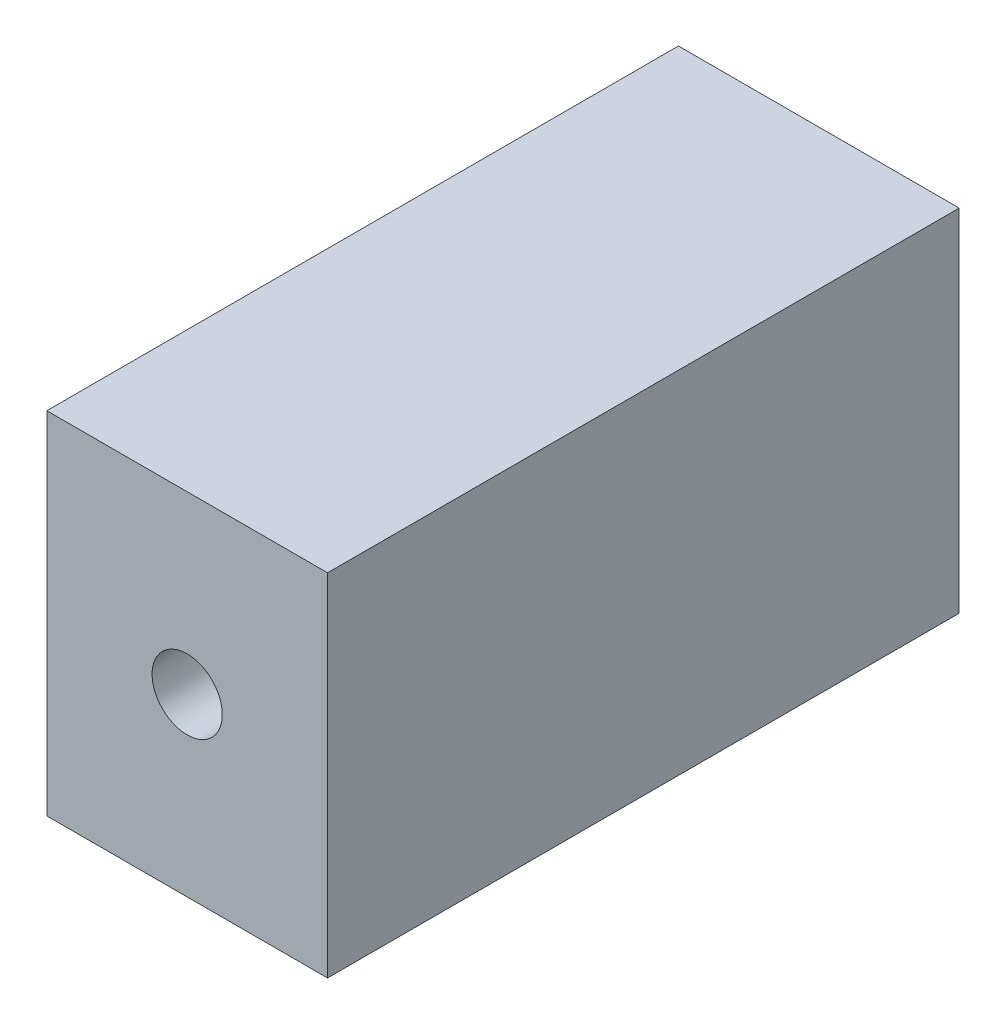
ISO-10303-21;
HEADER;
FILE_DESCRIPTION(('STEP AP214'),'2;1');
FILE_NAME('part.step','',(''),(''),'','','');
FILE_SCHEMA(('AUTOMOTIVE_DESIGN { 1 0 10303 214 1 1 1 1 }'));
ENDSEC;
DATA;
#1=APPLICATION_CONTEXT('core data for automotive mechanical design processes');
#2=APPLICATION_PROTOCOL_DEFINITION('international standard','automotive_design',2000,#1);
#3=PRODUCT_CONTEXT('',#1,'mechanical');
#4=PRODUCT('Part','Part','',(#3));
#5=PRODUCT_RELATED_PRODUCT_CATEGORY('part','',(#4));
#6=PRODUCT_DEFINITION_FORMATION('','',#4);
#7=PRODUCT_DEFINITION_CONTEXT('part definition',#1,'design');
#8=PRODUCT_DEFINITION('design','',#6,#7);
#9=PRODUCT_DEFINITION_SHAPE('','',#8);
#10=(LENGTH_UNIT() NAMED_UNIT(*) SI_UNIT(.MILLI.,.METRE.));
#11=(NAMED_UNIT(*) PLANE_ANGLE_UNIT() SI_UNIT($,.RADIAN.));
#12=(NAMED_UNIT(*) SI_UNIT($,.STERADIAN.) SOLID_ANGLE_UNIT());
#13=UNCERTAINTY_MEASURE_WITH_UNIT(LENGTH_MEASURE(1.E-05),#10,'distance_accuracy_value','');
#14=(GEOMETRIC_REPRESENTATION_CONTEXT(3) GLOBAL_UNCERTAINTY_ASSIGNED_CONTEXT((#13)) GLOBAL_UNIT_ASSIGNED_CONTEXT((#10,
#11,#12)) REPRESENTATION_CONTEXT('',''));
#15=CARTESIAN_POINT('',(0.,0.,0.));
#16=DIRECTION('',(0.,0.,1.));
#17=DIRECTION('',(1.,0.,0.));
#18=AXIS2_PLACEMENT_3D('',#15,#16,#17);
#19=CARTESIAN_POINT('',(0.,25.4,0.));
#20=DIRECTION('',(1.,0.,0.));
#21=DIRECTION('',(0.,0.,-1.));
#22=AXIS2_PLACEMENT_3D('',#19,#20,#21);
#23=PLANE('',#22);
#24=DIRECTION('',(0.,0.,1.));
#25=VECTOR('',#24,1.);
#26=CARTESIAN_POINT('',(0.,0.,0.));
#27=LINE('',#26,#25);
#28=CARTESIAN_POINT('',(0.,0.,0.));
#29=VERTEX_POINT('',#28);
#30=CARTESIAN_POINT('',(0.,0.,45.72));
#31=VERTEX_POINT('',#30);
#32=EDGE_CURVE('E107',#29,#31,#27,.T.);
#33=ORIENTED_EDGE('',*,*,#32,.T.);
#34=DIRECTION('',(0.,-1.,0.));
#35=VECTOR('',#34,1.);
#36=CARTESIAN_POINT('',(0.,25.4,45.72));
#37=LINE('',#36,#35);
#38=CARTESIAN_POINT('',(0.,25.4,45.72));
#39=VERTEX_POINT('',#38);
#40=EDGE_CURVE('E11',#39,#31,#37,.T.);
#41=ORIENTED_EDGE('',*,*,#40,.F.);
#42=DIRECTION('',(0.,0.,1.));
#43=VECTOR('',#42,1.);
#44=CARTESIAN_POINT('',(0.,25.4,0.));
#45=LINE('',#44,#43);
#46=CARTESIAN_POINT('',(0.,25.4,0.));
#47=VERTEX_POINT('',#46);
#48=EDGE_CURVE('E91',#47,#39,#45,.T.);
#49=ORIENTED_EDGE('',*,*,#48,.F.);
#50=DIRECTION('',(0.,-1.,0.));
#51=VECTOR('',#50,1.);
#52=CARTESIAN_POINT('',(0.,25.4,0.));
#53=LINE('',#52,#51);
#54=EDGE_CURVE('E103',#47,#29,#53,.T.);
#55=ORIENTED_EDGE('',*,*,#54,.T.);
#56=EDGE_LOOP('',(#33,#41,#49,#55));
#57=FACE_BOUND('',#56,.T.);
#58=ADVANCED_FACE('F39',(#57),#23,.F.);
#59=CARTESIAN_POINT('',(0.,25.4,45.72));
#60=DIRECTION('',(0.,0.,-1.));
#61=DIRECTION('',(-1.,0.,0.));
#62=AXIS2_PLACEMENT_3D('',#59,#60,#61);
#63=PLANE('',#62);
#64=CARTESIAN_POINT('',(10.16,12.7,45.72));
#65=DIRECTION('',(0.,0.,1.));
#66=DIRECTION('',(1.,0.,0.));
#67=AXIS2_PLACEMENT_3D('',#64,#65,#66);
#68=CIRCLE('',#67,2.54);
#69=CARTESIAN_POINT('',(12.7,12.7,45.72));
#70=VERTEX_POINT('',#69);
#71=EDGE_CURVE('E128',#70,#70,#68,.T.);
#72=ORIENTED_EDGE('',*,*,#71,.F.);
#73=EDGE_LOOP('',(#72));
#74=FACE_BOUND('',#73,.T.);
#75=DIRECTION('',(1.,0.,0.));
#76=VECTOR('',#75,1.);
#77=CARTESIAN_POINT('',(0.,0.,45.72));
#78=LINE('',#77,#76);
#79=CARTESIAN_POINT('',(20.32,0.,45.72));
#80=VERTEX_POINT('',#79);
#81=EDGE_CURVE('E96',#31,#80,#78,.T.);
#82=ORIENTED_EDGE('',*,*,#81,.T.);
#83=DIRECTION('',(0.,-1.,0.));
#84=VECTOR('',#83,1.);
#85=CARTESIAN_POINT('',(20.32,25.4,45.72));
#86=LINE('',#85,#84);
#87=CARTESIAN_POINT('',(20.32,25.4,45.72));
#88=VERTEX_POINT('',#87);
#89=EDGE_CURVE('E48',#88,#80,#86,.T.);
#90=ORIENTED_EDGE('',*,*,#89,.F.);
#91=DIRECTION('',(1.,0.,0.));
#92=VECTOR('',#91,1.);
#93=CARTESIAN_POINT('',(0.,25.4,45.72));
#94=LINE('',#93,#92);
#95=EDGE_CURVE('E86',#39,#88,#94,.T.);
#96=ORIENTED_EDGE('',*,*,#95,.F.);
#97=ORIENTED_EDGE('',*,*,#40,.T.);
#98=EDGE_LOOP('',(#82,#90,#96,#97));
#99=FACE_BOUND('',#98,.T.);
#100=ADVANCED_FACE('F95',(#74,#99),#63,.F.);
#101=CARTESIAN_POINT('',(20.32,25.4,0.));
#102=DIRECTION('',(-1.,0.,0.));
#103=DIRECTION('',(0.,0.,1.));
#104=AXIS2_PLACEMENT_3D('',#101,#102,#103);
#105=PLANE('',#104);
#106=DIRECTION('',(0.,0.,-1.));
#107=VECTOR('',#106,1.);
#108=CARTESIAN_POINT('',(20.32,0.,0.));
#109=LINE('',#108,#107);
#110=CARTESIAN_POINT('',(20.32,0.,0.));
#111=VERTEX_POINT('',#110);
#112=EDGE_CURVE('E73',#80,#111,#109,.T.);
#113=ORIENTED_EDGE('',*,*,#112,.T.);
#114=DIRECTION('',(0.,-1.,0.));
#115=VECTOR('',#114,1.);
#116=CARTESIAN_POINT('',(20.32,25.4,0.));
#117=LINE('',#116,#115);
#118=CARTESIAN_POINT('',(20.32,25.4,0.));
#119=VERTEX_POINT('',#118);
#120=EDGE_CURVE('E98',#119,#111,#117,.T.);
#121=ORIENTED_EDGE('',*,*,#120,.F.);
#122=DIRECTION('',(0.,0.,-1.));
#123=VECTOR('',#122,1.);
#124=CARTESIAN_POINT('',(20.32,25.4,0.));
#125=LINE('',#124,#123);
#126=EDGE_CURVE('E89',#88,#119,#125,.T.);
#127=ORIENTED_EDGE('',*,*,#126,.F.);
#128=ORIENTED_EDGE('',*,*,#89,.T.);
#129=EDGE_LOOP('',(#113,#121,#127,#128));
#130=FACE_BOUND('',#129,.T.);
#131=ADVANCED_FACE('F99',(#130),#105,.F.);
#132=CARTESIAN_POINT('',(0.,25.4,0.));
#133=DIRECTION('',(0.,0.,1.));
#134=DIRECTION('',(1.,0.,0.));
#135=AXIS2_PLACEMENT_3D('',#132,#133,#134);
#136=PLANE('',#135);
#137=CARTESIAN_POINT('',(10.16,12.7,0.));
#138=DIRECTION('',(0.,0.,1.));
#139=DIRECTION('',(1.,0.,0.));
#140=AXIS2_PLACEMENT_3D('',#137,#138,#139);
#141=CIRCLE('',#140,2.54);
#142=CARTESIAN_POINT('',(12.7,12.7,0.));
#143=VERTEX_POINT('',#142);
#144=EDGE_CURVE('E111',#143,#143,#141,.T.);
#145=ORIENTED_EDGE('',*,*,#144,.T.);
#146=EDGE_LOOP('',(#145));
#147=FACE_BOUND('',#146,.T.);
#148=DIRECTION('',(-1.,0.,0.));
#149=VECTOR('',#148,1.);
#150=CARTESIAN_POINT('',(0.,0.,0.));
#151=LINE('',#150,#149);
#152=EDGE_CURVE('E79',#111,#29,#151,.T.);
#153=ORIENTED_EDGE('',*,*,#152,.T.);
#154=ORIENTED_EDGE('',*,*,#54,.F.);
#155=DIRECTION('',(-1.,0.,0.));
#156=VECTOR('',#155,1.);
#157=CARTESIAN_POINT('',(0.,25.4,0.));
#158=LINE('',#157,#156);
#159=EDGE_CURVE('E56',#119,#47,#158,.T.);
#160=ORIENTED_EDGE('',*,*,#159,.F.);
#161=ORIENTED_EDGE('',*,*,#120,.T.);
#162=EDGE_LOOP('',(#153,#154,#160,#161));
#163=FACE_BOUND('',#162,.T.);
#164=ADVANCED_FACE('F121',(#147,#163),#136,.F.);
#165=CARTESIAN_POINT('',(0.,25.4,0.));
#166=DIRECTION('',(0.,1.,0.));
#167=DIRECTION('',(0.,0.,1.));
#168=AXIS2_PLACEMENT_3D('',#165,#166,#167);
#169=PLANE('',#168);
#170=ORIENTED_EDGE('',*,*,#48,.T.);
#171=ORIENTED_EDGE('',*,*,#95,.T.);
#172=ORIENTED_EDGE('',*,*,#126,.T.);
#173=ORIENTED_EDGE('',*,*,#159,.T.);
#174=EDGE_LOOP('',(#170,#171,#172,#173));
#175=FACE_BOUND('',#174,.T.);
#176=ADVANCED_FACE('F87',(#175),#169,.T.);
#177=CARTESIAN_POINT('',(0.,0.,0.));
#178=DIRECTION('',(0.,1.,0.));
#179=DIRECTION('',(0.,0.,1.));
#180=AXIS2_PLACEMENT_3D('',#177,#178,#179);
#181=PLANE('',#180);
#182=CARTESIAN_POINT('',(10.16,0.,35.56));
#183=DIRECTION('',(0.,-1.,0.));
#184=DIRECTION('',(0.,0.,-1.));
#185=AXIS2_PLACEMENT_3D('',#182,#183,#184);
#186=CIRCLE('',#185,2.54);
#187=CARTESIAN_POINT('',(10.16,0.,33.02));
#188=VERTEX_POINT('',#187);
#189=EDGE_CURVE('E144',#188,#188,#186,.T.);
#190=ORIENTED_EDGE('',*,*,#189,.F.);
#191=EDGE_LOOP('',(#190));
#192=FACE_BOUND('',#191,.T.);
#193=CARTESIAN_POINT('',(10.16,0.,10.16));
#194=DIRECTION('',(0.,-1.,0.));
#195=DIRECTION('',(0.,0.,-1.));
#196=AXIS2_PLACEMENT_3D('',#193,#194,#195);
#197=CIRCLE('',#196,2.54);
#198=CARTESIAN_POINT('',(10.16,0.,7.62));
#199=VERTEX_POINT('',#198);
#200=EDGE_CURVE('E136',#199,#199,#197,.T.);
#201=ORIENTED_EDGE('',*,*,#200,.F.);
#202=EDGE_LOOP('',(#201));
#203=FACE_BOUND('',#202,.T.);
#204=ORIENTED_EDGE('',*,*,#32,.F.);
#205=ORIENTED_EDGE('',*,*,#152,.F.);
#206=ORIENTED_EDGE('',*,*,#112,.F.);
#207=ORIENTED_EDGE('',*,*,#81,.F.);
#208=EDGE_LOOP('',(#204,#205,#206,#207));
#209=FACE_BOUND('',#208,.T.);
#210=ADVANCED_FACE('F124',(#192,#203,#209),#181,.F.);
#211=CARTESIAN_POINT('',(10.16,12.7,0.));
#212=DIRECTION('',(0.,0.,1.));
#213=DIRECTION('',(1.,0.,0.));
#214=AXIS2_PLACEMENT_3D('',#211,#212,#213);
#215=CYLINDRICAL_SURFACE('',#214,2.54);
#216=ORIENTED_EDGE('',*,*,#144,.F.);
#217=EDGE_LOOP('',(#216));
#218=FACE_BOUND('',#217,.T.);
#219=ORIENTED_EDGE('',*,*,#71,.T.);
#220=EDGE_LOOP('',(#219));
#221=FACE_BOUND('',#220,.T.);
#222=ADVANCED_FACE('F163',(#218,#221),#215,.F.);
#223=CARTESIAN_POINT('',(10.16,7.62,10.16));
#224=DIRECTION('',(0.,-1.,0.));
#225=DIRECTION('',(0.,0.,-1.));
#226=AXIS2_PLACEMENT_3D('',#223,#224,#225);
#227=CYLINDRICAL_SURFACE('',#226,2.54);
#228=CARTESIAN_POINT('',(10.16,7.62,10.16));
#229=DIRECTION('',(0.,-1.,0.));
#230=DIRECTION('',(0.,0.,-1.));
#231=AXIS2_PLACEMENT_3D('',#228,#229,#230);
#232=CIRCLE('',#231,2.54);
#233=CARTESIAN_POINT('',(10.16,7.62,7.62));
#234=VERTEX_POINT('',#233);
#235=EDGE_CURVE('E140',#234,#234,#232,.T.);
#236=CARTESIAN_POINT('',(10.16,7.62,7.62));
#237=CARTESIAN_POINT('',(10.16,7.540625,7.62));
#238=CARTESIAN_POINT('',(10.16,7.46125,7.62));
#239=CARTESIAN_POINT('',(10.16,7.3025,7.62));
#240=CARTESIAN_POINT('',(10.16,7.223125,7.62));
#241=CARTESIAN_POINT('',(10.16,7.064375,7.62));
#242=CARTESIAN_POINT('',(10.16,6.985,7.62));
#243=CARTESIAN_POINT('',(10.16,6.82625,7.62));
#244=CARTESIAN_POINT('',(10.16,6.746875,7.62));
#245=CARTESIAN_POINT('',(10.16,6.588125,7.62));
#246=CARTESIAN_POINT('',(10.16,6.50875,7.62));
#247=CARTESIAN_POINT('',(10.16,6.35,7.62));
#248=CARTESIAN_POINT('',(10.16,6.270625,7.62));
#249=CARTESIAN_POINT('',(10.16,6.111875,7.62));
#250=CARTESIAN_POINT('',(10.16,6.0325,7.62));
#251=CARTESIAN_POINT('',(10.16,5.87375,7.62));
#252=CARTESIAN_POINT('',(10.16,5.794375,7.62));
#253=CARTESIAN_POINT('',(10.16,5.635625,7.62));
#254=CARTESIAN_POINT('',(10.16,5.55625,7.62));
#255=CARTESIAN_POINT('',(10.16,5.3975,7.62));
#256=CARTESIAN_POINT('',(10.16,5.318125,7.62));
#257=CARTESIAN_POINT('',(10.16,5.159375,7.62));
#258=CARTESIAN_POINT('',(10.16,5.08,7.62));
#259=CARTESIAN_POINT('',(10.16,4.92125,7.62));
#260=CARTESIAN_POINT('',(10.16,4.841875,7.62));
#261=CARTESIAN_POINT('',(10.16,4.683125,7.62));
#262=CARTESIAN_POINT('',(10.16,4.60375,7.62));
#263=CARTESIAN_POINT('',(10.16,4.445,7.62));
#264=CARTESIAN_POINT('',(10.16,4.365625,7.62));
#265=CARTESIAN_POINT('',(10.16,4.206875,7.62));
#266=CARTESIAN_POINT('',(10.16,4.1275,7.62));
#267=CARTESIAN_POINT('',(10.16,3.96875,7.62));
#268=CARTESIAN_POINT('',(10.16,3.889375,7.62));
#269=CARTESIAN_POINT('',(10.16,3.730625,7.62));
#270=CARTESIAN_POINT('',(10.16,3.65125,7.62));
#271=CARTESIAN_POINT('',(10.16,3.4925,7.62));
#272=CARTESIAN_POINT('',(10.16,3.413125,7.62));
#273=CARTESIAN_POINT('',(10.16,3.254375,7.62));
#274=CARTESIAN_POINT('',(10.16,3.175,7.62));
#275=CARTESIAN_POINT('',(10.16,3.01625,7.62));
#276=CARTESIAN_POINT('',(10.16,2.936875,7.62));
#277=CARTESIAN_POINT('',(10.16,2.778125,7.62));
#278=CARTESIAN_POINT('',(10.16,2.69875,7.62));
#279=CARTESIAN_POINT('',(10.16,2.54,7.62));
#280=CARTESIAN_POINT('',(10.16,2.460625,7.62));
#281=CARTESIAN_POINT('',(10.16,2.301875,7.62));
#282=CARTESIAN_POINT('',(10.16,2.2225,7.62));
#283=CARTESIAN_POINT('',(10.16,2.06375,7.62));
#284=CARTESIAN_POINT('',(10.16,1.984375,7.62));
#285=CARTESIAN_POINT('',(10.16,1.825625,7.62));
#286=CARTESIAN_POINT('',(10.16,1.74625,7.62));
#287=CARTESIAN_POINT('',(10.16,1.5875,7.62));
#288=CARTESIAN_POINT('',(10.16,1.508125,7.62));
#289=CARTESIAN_POINT('',(10.16,1.349375,7.62));
#290=CARTESIAN_POINT('',(10.16,1.27,7.62));
#291=CARTESIAN_POINT('',(10.16,1.11125,7.62));
#292=CARTESIAN_POINT('',(10.16,1.031875,7.62));
#293=CARTESIAN_POINT('',(10.16,0.873125,7.62));
#294=CARTESIAN_POINT('',(10.16,0.79375,7.62));
#295=CARTESIAN_POINT('',(10.16,0.635,7.62));
#296=CARTESIAN_POINT('',(10.16,0.555625,7.62));
#297=CARTESIAN_POINT('',(10.16,0.396875,7.62));
#298=CARTESIAN_POINT('',(10.16,0.3175,7.62));
#299=CARTESIAN_POINT('',(10.16,0.15875,7.62));
#300=CARTESIAN_POINT('',(10.16,0.0793749999999999,7.62));
#301=CARTESIAN_POINT('',(10.16,0.,7.62));
#302=B_SPLINE_CURVE_WITH_KNOTS('',3,(#236,#237,#238,#239,#240,#241,#242,#243,#244,#245,#246,
#247,#248,#249,#250,#251,#252,#253,#254,#255,#256,#257,#258,#259,#260,#261,#262,#263,#264,#265,
#266,#267,#268,#269,#270,#271,#272,#273,#274,#275,#276,#277,#278,#279,#280,#281,#282,#283,#284,
#285,#286,#287,#288,#289,#290,#291,#292,#293,#294,#295,#296,#297,#298,#299,#300,#301),
.UNSPECIFIED.,.F.,.F.,(4,2,2,2,2,2,2,2,2,2,2,2,2,2,2,2,2,2,2,2,2,2,2,2,2,2,2,2,2,2,2,2,4),(0.,
0.238125,0.47625,0.714375000000001,0.9525,1.190625,1.42875,1.666875,1.905,2.143125,2.38125,
2.619375,2.8575,3.095625,3.33375,3.571875,3.81,4.048125,4.28625,4.524375,4.7625,5.000625,
5.23875,5.476875,5.715,5.953125,6.19125,6.429375,6.6675,6.905625,7.14375,7.381875,7.62),.UNSPECIFIED.);
#303=EDGE_CURVE('BSEAM167',#234,#199,#302,.T.);
#304=ORIENTED_EDGE('',*,*,#235,.F.);
#305=ORIENTED_EDGE('',*,*,#200,.T.);
#306=ORIENTED_EDGE('',*,*,#303,.T.);
#307=ORIENTED_EDGE('',*,*,#303,.F.);
#308=EDGE_LOOP('',(#304,#306,#305,#307));
#309=FACE_BOUND('',#308,.T.);
#310=ADVANCED_FACE('F167',(#309),#227,.F.);
#311=CARTESIAN_POINT('',(10.16,7.62,10.16));
#312=DIRECTION('',(0.,-1.,0.));
#313=DIRECTION('',(0.,0.,-1.));
#314=AXIS2_PLACEMENT_3D('',#311,#312,#313);
#315=PLANE('',#314);
#316=ORIENTED_EDGE('',*,*,#235,.T.);
#317=EDGE_LOOP('',(#316));
#318=FACE_BOUND('',#317,.T.);
#319=ADVANCED_FACE('F157',(#318),#315,.T.);
#320=CARTESIAN_POINT('',(10.16,7.62,35.56));
#321=DIRECTION('',(0.,-1.,0.));
#322=DIRECTION('',(0.,0.,-1.));
#323=AXIS2_PLACEMENT_3D('',#320,#321,#322);
#324=CYLINDRICAL_SURFACE('',#323,2.54);
#325=CARTESIAN_POINT('',(10.16,7.62,35.56));
#326=DIRECTION('',(0.,-1.,0.));
#327=DIRECTION('',(0.,0.,-1.));
#328=AXIS2_PLACEMENT_3D('',#325,#326,#327);
#329=CIRCLE('',#328,2.54);
#330=CARTESIAN_POINT('',(10.16,7.62,33.02));
#331=VERTEX_POINT('',#330);
#332=EDGE_CURVE('E132',#331,#331,#329,.T.);
#333=CARTESIAN_POINT('',(10.16,7.62,33.02));
#334=CARTESIAN_POINT('',(10.16,7.540625,33.02));
#335=CARTESIAN_POINT('',(10.16,7.46125,33.02));
#336=CARTESIAN_POINT('',(10.16,7.3025,33.02));
#337=CARTESIAN_POINT('',(10.16,7.223125,33.02));
#338=CARTESIAN_POINT('',(10.16,7.064375,33.02));
#339=CARTESIAN_POINT('',(10.16,6.985,33.02));
#340=CARTESIAN_POINT('',(10.16,6.82625,33.02));
#341=CARTESIAN_POINT('',(10.16,6.746875,33.02));
#342=CARTESIAN_POINT('',(10.16,6.588125,33.02));
#343=CARTESIAN_POINT('',(10.16,6.50875,33.02));
#344=CARTESIAN_POINT('',(10.16,6.35,33.02));
#345=CARTESIAN_POINT('',(10.16,6.270625,33.02));
#346=CARTESIAN_POINT('',(10.16,6.111875,33.02));
#347=CARTESIAN_POINT('',(10.16,6.0325,33.02));
#348=CARTESIAN_POINT('',(10.16,5.87375,33.02));
#349=CARTESIAN_POINT('',(10.16,5.794375,33.02));
#350=CARTESIAN_POINT('',(10.16,5.635625,33.02));
#351=CARTESIAN_POINT('',(10.16,5.55625,33.02));
#352=CARTESIAN_POINT('',(10.16,5.3975,33.02));
#353=CARTESIAN_POINT('',(10.16,5.318125,33.02));
#354=CARTESIAN_POINT('',(10.16,5.159375,33.02));
#355=CARTESIAN_POINT('',(10.16,5.08,33.02));
#356=CARTESIAN_POINT('',(10.16,4.92125,33.02));
#357=CARTESIAN_POINT('',(10.16,4.841875,33.02));
#358=CARTESIAN_POINT('',(10.16,4.683125,33.02));
#359=CARTESIAN_POINT('',(10.16,4.60375,33.02));
#360=CARTESIAN_POINT('',(10.16,4.445,33.02));
#361=CARTESIAN_POINT('',(10.16,4.365625,33.02));
#362=CARTESIAN_POINT('',(10.16,4.206875,33.02));
#363=CARTESIAN_POINT('',(10.16,4.1275,33.02));
#364=CARTESIAN_POINT('',(10.16,3.96875,33.02));
#365=CARTESIAN_POINT('',(10.16,3.889375,33.02));
#366=CARTESIAN_POINT('',(10.16,3.730625,33.02));
#367=CARTESIAN_POINT('',(10.16,3.65125,33.02));
#368=CARTESIAN_POINT('',(10.16,3.4925,33.02));
#369=CARTESIAN_POINT('',(10.16,3.413125,33.02));
#370=CARTESIAN_POINT('',(10.16,3.254375,33.02));
#371=CARTESIAN_POINT('',(10.16,3.175,33.02));
#372=CARTESIAN_POINT('',(10.16,3.01625,33.02));
#373=CARTESIAN_POINT('',(10.16,2.936875,33.02));
#374=CARTESIAN_POINT('',(10.16,2.778125,33.02));
#375=CARTESIAN_POINT('',(10.16,2.69875,33.02));
#376=CARTESIAN_POINT('',(10.16,2.54,33.02));
#377=CARTESIAN_POINT('',(10.16,2.460625,33.02));
#378=CARTESIAN_POINT('',(10.16,2.301875,33.02));
#379=CARTESIAN_POINT('',(10.16,2.2225,33.02));
#380=CARTESIAN_POINT('',(10.16,2.06375,33.02));
#381=CARTESIAN_POINT('',(10.16,1.984375,33.02));
#382=CARTESIAN_POINT('',(10.16,1.825625,33.02));
#383=CARTESIAN_POINT('',(10.16,1.74625,33.02));
#384=CARTESIAN_POINT('',(10.16,1.5875,33.02));
#385=CARTESIAN_POINT('',(10.16,1.508125,33.02));
#386=CARTESIAN_POINT('',(10.16,1.349375,33.02));
#387=CARTESIAN_POINT('',(10.16,1.27,33.02));
#388=CARTESIAN_POINT('',(10.16,1.11125,33.02));
#389=CARTESIAN_POINT('',(10.16,1.031875,33.02));
#390=CARTESIAN_POINT('',(10.16,0.873125,33.02));
#391=CARTESIAN_POINT('',(10.16,0.79375,33.02));
#392=CARTESIAN_POINT('',(10.16,0.635,33.02));
#393=CARTESIAN_POINT('',(10.16,0.555625,33.02));
#394=CARTESIAN_POINT('',(10.16,0.396875,33.02));
#395=CARTESIAN_POINT('',(10.16,0.3175,33.02));
#396=CARTESIAN_POINT('',(10.16,0.15875,33.02));
#397=CARTESIAN_POINT('',(10.16,0.0793749999999999,33.02));
#398=CARTESIAN_POINT('',(10.16,0.,33.02));
#399=B_SPLINE_CURVE_WITH_KNOTS('',3,(#333,#334,#335,#336,#337,#338,#339,#340,#341,#342,#343,
#344,#345,#346,#347,#348,#349,#350,#351,#352,#353,#354,#355,#356,#357,#358,#359,#360,#361,#362,
#363,#364,#365,#366,#367,#368,#369,#370,#371,#372,#373,#374,#375,#376,#377,#378,#379,#380,#381,
#382,#383,#384,#385,#386,#387,#388,#389,#390,#391,#392,#393,#394,#395,#396,#397,#398),
.UNSPECIFIED.,.F.,.F.,(4,2,2,2,2,2,2,2,2,2,2,2,2,2,2,2,2,2,2,2,2,2,2,2,2,2,2,2,2,2,2,2,4),(0.,
0.238125,0.47625,0.714375000000001,0.9525,1.190625,1.42875,1.666875,1.905,2.143125,2.38125,
2.619375,2.8575,3.095625,3.33375,3.571875,3.81,4.048125,4.28625,4.524375,4.7625,5.000625,
5.23875,5.476875,5.715,5.953125,6.19125,6.429375,6.6675,6.905625,7.14375,7.381875,7.62),.UNSPECIFIED.);
#400=EDGE_CURVE('BSEAM154',#331,#188,#399,.T.);
#401=ORIENTED_EDGE('',*,*,#332,.F.);
#402=ORIENTED_EDGE('',*,*,#189,.T.);
#403=ORIENTED_EDGE('',*,*,#400,.T.);
#404=ORIENTED_EDGE('',*,*,#400,.F.);
#405=EDGE_LOOP('',(#401,#403,#402,#404));
#406=FACE_BOUND('',#405,.T.);
#407=ADVANCED_FACE('F154',(#406),#324,.F.);
#408=CARTESIAN_POINT('',(10.16,7.62,35.56));
#409=DIRECTION('',(0.,-1.,0.));
#410=DIRECTION('',(0.,0.,-1.));
#411=AXIS2_PLACEMENT_3D('',#408,#409,#410);
#412=PLANE('',#411);
#413=ORIENTED_EDGE('',*,*,#332,.T.);
#414=EDGE_LOOP('',(#413));
#415=FACE_BOUND('',#414,.T.);
#416=ADVANCED_FACE('F152',(#415),#412,.T.);
#417=CLOSED_SHELL('',(#58,#100,#131,#164,#176,#210,#222,#310,#319,#407,#416));
#418=MANIFOLD_SOLID_BREP('B2',#417);
#419=ADVANCED_BREP_SHAPE_REPRESENTATION('',(#18,#418),#14);
#420=SHAPE_DEFINITION_REPRESENTATION(#9,#419);
ENDSEC;
END-ISO-10303-21;
